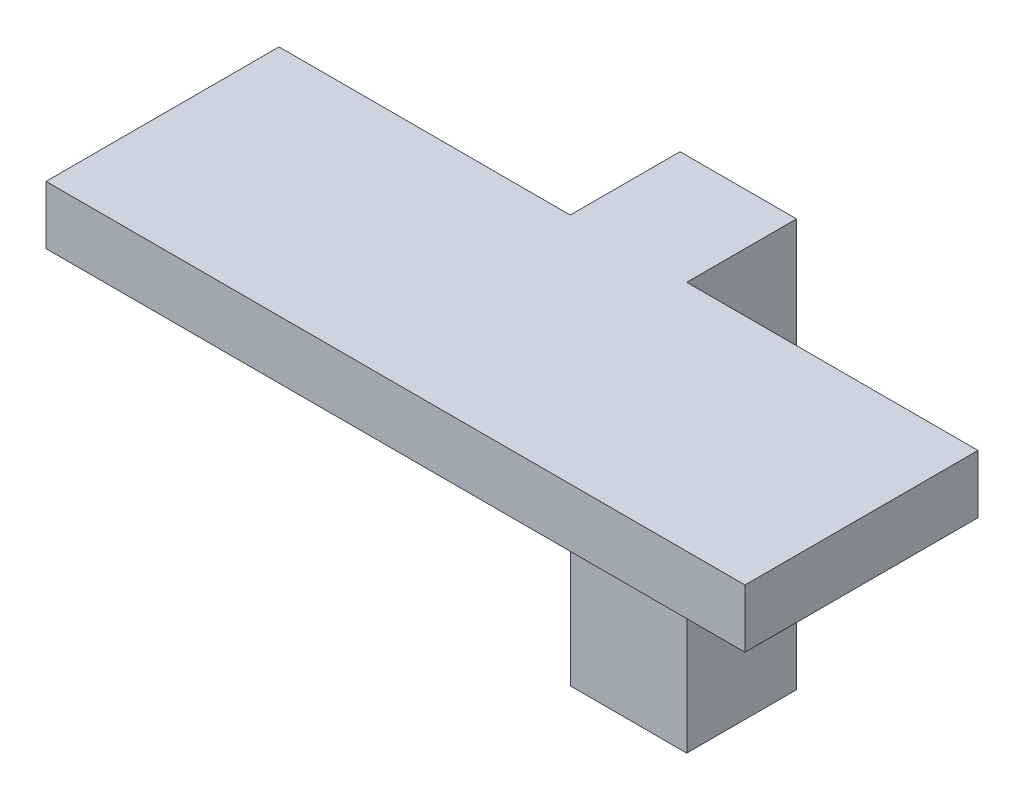
ISO-10303-21;
HEADER;
FILE_DESCRIPTION(('STEP AP214'),'2;1');
FILE_NAME('part.step','',(''),(''),'','','');
FILE_SCHEMA(('AUTOMOTIVE_DESIGN { 1 0 10303 214 1 1 1 1 }'));
ENDSEC;
DATA;
#1=APPLICATION_CONTEXT('core data for automotive mechanical design processes');
#2=APPLICATION_PROTOCOL_DEFINITION('international standard','automotive_design',2000,#1);
#3=PRODUCT_CONTEXT('',#1,'mechanical');
#4=PRODUCT('Part','Part','',(#3));
#5=PRODUCT_RELATED_PRODUCT_CATEGORY('part','',(#4));
#6=PRODUCT_DEFINITION_FORMATION('','',#4);
#7=PRODUCT_DEFINITION_CONTEXT('part definition',#1,'design');
#8=PRODUCT_DEFINITION('design','',#6,#7);
#9=PRODUCT_DEFINITION_SHAPE('','',#8);
#10=(LENGTH_UNIT() NAMED_UNIT(*) SI_UNIT(.MILLI.,.METRE.));
#11=(NAMED_UNIT(*) PLANE_ANGLE_UNIT() SI_UNIT($,.RADIAN.));
#12=(NAMED_UNIT(*) SI_UNIT($,.STERADIAN.) SOLID_ANGLE_UNIT());
#13=UNCERTAINTY_MEASURE_WITH_UNIT(LENGTH_MEASURE(1.E-05),#10,'distance_accuracy_value','');
#14=(GEOMETRIC_REPRESENTATION_CONTEXT(3) GLOBAL_UNCERTAINTY_ASSIGNED_CONTEXT((#13)) GLOBAL_UNIT_ASSIGNED_CONTEXT((#10,
#11,#12)) REPRESENTATION_CONTEXT('',''));
#15=CARTESIAN_POINT('',(0.,0.,0.));
#16=DIRECTION('',(0.,0.,1.));
#17=DIRECTION('',(1.,0.,0.));
#18=AXIS2_PLACEMENT_3D('',#15,#16,#17);
#19=CARTESIAN_POINT('',(0.,5.,-10.));
#20=DIRECTION('',(0.,0.,-1.));
#21=DIRECTION('',(-1.,0.,0.));
#22=AXIS2_PLACEMENT_3D('',#19,#20,#21);
#23=PLANE('',#22);
#24=DIRECTION('',(1.,0.,0.));
#25=VECTOR('',#24,1.);
#26=CARTESIAN_POINT('',(0.,0.,-10.));
#27=LINE('',#26,#25);
#28=CARTESIAN_POINT('',(-30.,0.,-10.));
#29=VERTEX_POINT('',#28);
#30=CARTESIAN_POINT('',(-5.00000000000001,0.,-10.));
#31=VERTEX_POINT('',#30);
#32=EDGE_CURVE('E140',#29,#31,#27,.T.);
#33=ORIENTED_EDGE('',*,*,#32,.F.);
#34=DIRECTION('',(0.,-1.,0.));
#35=VECTOR('',#34,1.);
#36=CARTESIAN_POINT('',(-30.,5.,-10.));
#37=LINE('',#36,#35);
#38=CARTESIAN_POINT('',(-30.,5.,-10.));
#39=VERTEX_POINT('',#38);
#40=EDGE_CURVE('E11',#39,#29,#37,.T.);
#41=ORIENTED_EDGE('',*,*,#40,.F.);
#42=DIRECTION('',(1.,0.,0.));
#43=VECTOR('',#42,1.);
#44=CARTESIAN_POINT('',(0.,5.,-10.));
#45=LINE('',#44,#43);
#46=CARTESIAN_POINT('',(-5.00000000000001,5.,-10.));
#47=VERTEX_POINT('',#46);
#48=EDGE_CURVE('E176',#39,#47,#45,.T.);
#49=ORIENTED_EDGE('',*,*,#48,.T.);
#50=DIRECTION('',(0.,-1.,0.));
#51=VECTOR('',#50,1.);
#52=CARTESIAN_POINT('',(-5.00000000000001,5.,-10.));
#53=LINE('',#52,#51);
#54=EDGE_CURVE('E136',#47,#31,#53,.T.);
#55=ORIENTED_EDGE('',*,*,#54,.T.);
#56=EDGE_LOOP('',(#33,#41,#49,#55));
#57=FACE_BOUND('',#56,.T.);
#58=ADVANCED_FACE('F39',(#57),#23,.T.);
#59=CARTESIAN_POINT('',(-30.,5.,0.));
#60=DIRECTION('',(1.,0.,0.));
#61=DIRECTION('',(0.,0.,-1.));
#62=AXIS2_PLACEMENT_3D('',#59,#60,#61);
#63=PLANE('',#62);
#64=DIRECTION('',(0.,0.,1.));
#65=VECTOR('',#64,1.);
#66=CARTESIAN_POINT('',(-30.,0.,0.));
#67=LINE('',#66,#65);
#68=CARTESIAN_POINT('',(-30.,0.,10.));
#69=VERTEX_POINT('',#68);
#70=EDGE_CURVE('E143',#29,#69,#67,.T.);
#71=ORIENTED_EDGE('',*,*,#70,.T.);
#72=DIRECTION('',(0.,-1.,0.));
#73=VECTOR('',#72,1.);
#74=CARTESIAN_POINT('',(-30.,5.,10.));
#75=LINE('',#74,#73);
#76=CARTESIAN_POINT('',(-30.,5.,10.));
#77=VERTEX_POINT('',#76);
#78=EDGE_CURVE('E48',#77,#69,#75,.T.);
#79=ORIENTED_EDGE('',*,*,#78,.F.);
#80=DIRECTION('',(0.,0.,1.));
#81=VECTOR('',#80,1.);
#82=CARTESIAN_POINT('',(-30.,5.,0.));
#83=LINE('',#82,#81);
#84=EDGE_CURVE('E177',#39,#77,#83,.T.);
#85=ORIENTED_EDGE('',*,*,#84,.F.);
#86=ORIENTED_EDGE('',*,*,#40,.T.);
#87=EDGE_LOOP('',(#71,#79,#85,#86));
#88=FACE_BOUND('',#87,.T.);
#89=ADVANCED_FACE('F41',(#88),#63,.F.);
#90=CARTESIAN_POINT('',(0.,5.,10.));
#91=DIRECTION('',(0.,0.,-1.));
#92=DIRECTION('',(-1.,0.,0.));
#93=AXIS2_PLACEMENT_3D('',#90,#91,#92);
#94=PLANE('',#93);
#95=DIRECTION('',(1.,0.,0.));
#96=VECTOR('',#95,1.);
#97=CARTESIAN_POINT('',(0.,0.,10.));
#98=LINE('',#97,#96);
#99=CARTESIAN_POINT('',(30.,0.,10.));
#100=VERTEX_POINT('',#99);
#101=EDGE_CURVE('E146',#69,#100,#98,.T.);
#102=ORIENTED_EDGE('',*,*,#101,.T.);
#103=DIRECTION('',(0.,-1.,0.));
#104=VECTOR('',#103,1.);
#105=CARTESIAN_POINT('',(30.,5.,10.));
#106=LINE('',#105,#104);
#107=CARTESIAN_POINT('',(30.,5.,10.));
#108=VERTEX_POINT('',#107);
#109=EDGE_CURVE('E157',#108,#100,#106,.T.);
#110=ORIENTED_EDGE('',*,*,#109,.F.);
#111=DIRECTION('',(1.,0.,0.));
#112=VECTOR('',#111,1.);
#113=CARTESIAN_POINT('',(0.,5.,10.));
#114=LINE('',#113,#112);
#115=EDGE_CURVE('E165',#77,#108,#114,.T.);
#116=ORIENTED_EDGE('',*,*,#115,.F.);
#117=ORIENTED_EDGE('',*,*,#78,.T.);
#118=EDGE_LOOP('',(#102,#110,#116,#117));
#119=FACE_BOUND('',#118,.T.);
#120=ADVANCED_FACE('F163',(#119),#94,.F.);
#121=CARTESIAN_POINT('',(30.,5.,0.));
#122=DIRECTION('',(1.,0.,0.));
#123=DIRECTION('',(0.,0.,-1.));
#124=AXIS2_PLACEMENT_3D('',#121,#122,#123);
#125=PLANE('',#124);
#126=DIRECTION('',(0.,0.,1.));
#127=VECTOR('',#126,1.);
#128=CARTESIAN_POINT('',(30.,0.,0.));
#129=LINE('',#128,#127);
#130=CARTESIAN_POINT('',(30.,0.,-10.));
#131=VERTEX_POINT('',#130);
#132=EDGE_CURVE('E149',#131,#100,#129,.T.);
#133=ORIENTED_EDGE('',*,*,#132,.F.);
#134=DIRECTION('',(0.,-1.,0.));
#135=VECTOR('',#134,1.);
#136=CARTESIAN_POINT('',(30.,5.,-10.));
#137=LINE('',#136,#135);
#138=CARTESIAN_POINT('',(30.,5.,-10.));
#139=VERTEX_POINT('',#138);
#140=EDGE_CURVE('E77',#139,#131,#137,.T.);
#141=ORIENTED_EDGE('',*,*,#140,.F.);
#142=DIRECTION('',(0.,0.,1.));
#143=VECTOR('',#142,1.);
#144=CARTESIAN_POINT('',(30.,5.,0.));
#145=LINE('',#144,#143);
#146=EDGE_CURVE('E174',#139,#108,#145,.T.);
#147=ORIENTED_EDGE('',*,*,#146,.T.);
#148=ORIENTED_EDGE('',*,*,#109,.T.);
#149=EDGE_LOOP('',(#133,#141,#147,#148));
#150=FACE_BOUND('',#149,.T.);
#151=ADVANCED_FACE('F172',(#150),#125,.T.);
#152=CARTESIAN_POINT('',(5.,0.,-10.));
#153=VERTEX_POINT('',#152);
#154=EDGE_CURVE('E144',#153,#131,#27,.T.);
#155=ORIENTED_EDGE('',*,*,#154,.F.);
#156=DIRECTION('',(0.,-1.,0.));
#157=VECTOR('',#156,1.);
#158=CARTESIAN_POINT('',(5.,5.,-10.));
#159=LINE('',#158,#157);
#160=CARTESIAN_POINT('',(5.,5.,-10.));
#161=VERTEX_POINT('',#160);
#162=EDGE_CURVE('E124',#161,#153,#159,.T.);
#163=ORIENTED_EDGE('',*,*,#162,.F.);
#164=EDGE_CURVE('E131',#161,#139,#45,.T.);
#165=ORIENTED_EDGE('',*,*,#164,.T.);
#166=ORIENTED_EDGE('',*,*,#140,.T.);
#167=EDGE_LOOP('',(#155,#163,#165,#166));
#168=FACE_BOUND('',#167,.T.);
#169=ADVANCED_FACE('F213',(#168),#23,.T.);
#170=CARTESIAN_POINT('',(5.,5.,0.));
#171=DIRECTION('',(1.,0.,0.));
#172=DIRECTION('',(0.,0.,-1.));
#173=AXIS2_PLACEMENT_3D('',#170,#171,#172);
#174=PLANE('',#173);
#175=ORIENTED_EDGE('',*,*,#162,.T.);
#176=DIRECTION('',(0.,1.,0.));
#177=VECTOR('',#176,1.);
#178=CARTESIAN_POINT('',(5.,-30.,-10.));
#179=LINE('',#178,#177);
#180=CARTESIAN_POINT('',(5.,-30.,-10.));
#181=VERTEX_POINT('',#180);
#182=EDGE_CURVE('E85',#181,#153,#179,.T.);
#183=ORIENTED_EDGE('',*,*,#182,.F.);
#184=DIRECTION('',(0.,0.,1.));
#185=VECTOR('',#184,1.);
#186=CARTESIAN_POINT('',(5.,-30.,0.));
#187=LINE('',#186,#185);
#188=CARTESIAN_POINT('',(4.99999999999999,-30.,-19.4230360085631));
#189=VERTEX_POINT('',#188);
#190=EDGE_CURVE('E119',#189,#181,#187,.T.);
#191=ORIENTED_EDGE('',*,*,#190,.F.);
#192=DIRECTION('',(0.,-1.,0.));
#193=VECTOR('',#192,1.);
#194=CARTESIAN_POINT('',(4.99999999999999,5.,-19.4230360085631));
#195=LINE('',#194,#193);
#196=CARTESIAN_POINT('',(4.99999999999999,5.,-19.4230360085631));
#197=VERTEX_POINT('',#196);
#198=EDGE_CURVE('E112',#197,#189,#195,.T.);
#199=ORIENTED_EDGE('',*,*,#198,.F.);
#200=DIRECTION('',(0.,0.,1.));
#201=VECTOR('',#200,1.);
#202=CARTESIAN_POINT('',(5.,5.,0.));
#203=LINE('',#202,#201);
#204=EDGE_CURVE('E116',#197,#161,#203,.T.);
#205=ORIENTED_EDGE('',*,*,#204,.T.);
#206=EDGE_LOOP('',(#175,#183,#191,#199,#205));
#207=FACE_BOUND('',#206,.T.);
#208=ADVANCED_FACE('F115',(#207),#174,.T.);
#209=CARTESIAN_POINT('',(0.,5.,-19.4230360085631));
#210=DIRECTION('',(0.,0.,-1.));
#211=DIRECTION('',(-1.,0.,0.));
#212=AXIS2_PLACEMENT_3D('',#209,#210,#211);
#213=PLANE('',#212);
#214=ORIENTED_EDGE('',*,*,#198,.T.);
#215=DIRECTION('',(1.,0.,0.));
#216=VECTOR('',#215,1.);
#217=CARTESIAN_POINT('',(0.,-30.,-19.4230360085631));
#218=LINE('',#217,#216);
#219=CARTESIAN_POINT('',(-5.00000000000001,-30.,-19.4230360085631));
#220=VERTEX_POINT('',#219);
#221=EDGE_CURVE('E192',#220,#189,#218,.T.);
#222=ORIENTED_EDGE('',*,*,#221,.F.);
#223=DIRECTION('',(0.,-1.,0.));
#224=VECTOR('',#223,1.);
#225=CARTESIAN_POINT('',(-5.00000000000001,5.,-19.4230360085631));
#226=LINE('',#225,#224);
#227=CARTESIAN_POINT('',(-5.00000000000001,5.,-19.4230360085631));
#228=VERTEX_POINT('',#227);
#229=EDGE_CURVE('E125',#228,#220,#226,.T.);
#230=ORIENTED_EDGE('',*,*,#229,.F.);
#231=DIRECTION('',(1.,0.,0.));
#232=VECTOR('',#231,1.);
#233=CARTESIAN_POINT('',(0.,5.,-19.4230360085631));
#234=LINE('',#233,#232);
#235=EDGE_CURVE('E129',#228,#197,#234,.T.);
#236=ORIENTED_EDGE('',*,*,#235,.T.);
#237=EDGE_LOOP('',(#214,#222,#230,#236));
#238=FACE_BOUND('',#237,.T.);
#239=ADVANCED_FACE('F133',(#238),#213,.T.);
#240=CARTESIAN_POINT('',(-5.00000000000001,5.,0.));
#241=DIRECTION('',(1.,0.,0.));
#242=DIRECTION('',(0.,0.,-1.));
#243=AXIS2_PLACEMENT_3D('',#240,#241,#242);
#244=PLANE('',#243);
#245=ORIENTED_EDGE('',*,*,#229,.T.);
#246=DIRECTION('',(0.,0.,1.));
#247=VECTOR('',#246,1.);
#248=CARTESIAN_POINT('',(-5.00000000000001,-30.,0.));
#249=LINE('',#248,#247);
#250=CARTESIAN_POINT('',(-5.00000000000001,-30.,-10.));
#251=VERTEX_POINT('',#250);
#252=EDGE_CURVE('E189',#220,#251,#249,.T.);
#253=ORIENTED_EDGE('',*,*,#252,.T.);
#254=DIRECTION('',(0.,1.,0.));
#255=VECTOR('',#254,1.);
#256=CARTESIAN_POINT('',(-5.00000000000001,-30.,-10.));
#257=LINE('',#256,#255);
#258=EDGE_CURVE('E181',#251,#31,#257,.T.);
#259=ORIENTED_EDGE('',*,*,#258,.T.);
#260=ORIENTED_EDGE('',*,*,#54,.F.);
#261=DIRECTION('',(0.,0.,1.));
#262=VECTOR('',#261,1.);
#263=CARTESIAN_POINT('',(-5.00000000000001,5.,0.));
#264=LINE('',#263,#262);
#265=EDGE_CURVE('E56',#228,#47,#264,.T.);
#266=ORIENTED_EDGE('',*,*,#265,.F.);
#267=EDGE_LOOP('',(#245,#253,#259,#260,#266));
#268=FACE_BOUND('',#267,.T.);
#269=ADVANCED_FACE('F204',(#268),#244,.F.);
#270=CARTESIAN_POINT('',(0.,5.,0.));
#271=DIRECTION('',(0.,1.,0.));
#272=DIRECTION('',(0.,0.,1.));
#273=AXIS2_PLACEMENT_3D('',#270,#271,#272);
#274=PLANE('',#273);
#275=ORIENTED_EDGE('',*,*,#48,.F.);
#276=ORIENTED_EDGE('',*,*,#84,.T.);
#277=ORIENTED_EDGE('',*,*,#115,.T.);
#278=ORIENTED_EDGE('',*,*,#146,.F.);
#279=ORIENTED_EDGE('',*,*,#164,.F.);
#280=ORIENTED_EDGE('',*,*,#204,.F.);
#281=ORIENTED_EDGE('',*,*,#235,.F.);
#282=ORIENTED_EDGE('',*,*,#265,.T.);
#283=EDGE_LOOP('',(#275,#276,#277,#278,#279,#280,#281,#282));
#284=FACE_BOUND('',#283,.T.);
#285=ADVANCED_FACE('F128',(#284),#274,.T.);
#286=CARTESIAN_POINT('',(0.,0.,0.));
#287=DIRECTION('',(0.,1.,0.));
#288=DIRECTION('',(0.,0.,1.));
#289=AXIS2_PLACEMENT_3D('',#286,#287,#288);
#290=PLANE('',#289);
#291=ORIENTED_EDGE('',*,*,#32,.T.);
#292=DIRECTION('',(1.,0.,0.));
#293=VECTOR('',#292,1.);
#294=CARTESIAN_POINT('',(0.,0.,-10.));
#295=LINE('',#294,#293);
#296=EDGE_CURVE('E186',#31,#153,#295,.T.);
#297=ORIENTED_EDGE('',*,*,#296,.T.);
#298=ORIENTED_EDGE('',*,*,#154,.T.);
#299=ORIENTED_EDGE('',*,*,#132,.T.);
#300=ORIENTED_EDGE('',*,*,#101,.F.);
#301=ORIENTED_EDGE('',*,*,#70,.F.);
#302=EDGE_LOOP('',(#291,#297,#298,#299,#300,#301));
#303=FACE_BOUND('',#302,.T.);
#304=ADVANCED_FACE('F169',(#303),#290,.F.);
#305=CARTESIAN_POINT('',(0.,-30.,-10.));
#306=DIRECTION('',(0.,0.,1.));
#307=DIRECTION('',(1.,0.,0.));
#308=AXIS2_PLACEMENT_3D('',#305,#306,#307);
#309=PLANE('',#308);
#310=ORIENTED_EDGE('',*,*,#296,.F.);
#311=ORIENTED_EDGE('',*,*,#258,.F.);
#312=DIRECTION('',(1.,0.,0.));
#313=VECTOR('',#312,1.);
#314=CARTESIAN_POINT('',(0.,-30.,-10.));
#315=LINE('',#314,#313);
#316=EDGE_CURVE('E184',#251,#181,#315,.T.);
#317=ORIENTED_EDGE('',*,*,#316,.T.);
#318=ORIENTED_EDGE('',*,*,#182,.T.);
#319=EDGE_LOOP('',(#310,#311,#317,#318));
#320=FACE_BOUND('',#319,.T.);
#321=ADVANCED_FACE('F200',(#320),#309,.T.);
#322=CARTESIAN_POINT('',(0.,-30.,0.));
#323=DIRECTION('',(0.,1.,0.));
#324=DIRECTION('',(0.,0.,1.));
#325=AXIS2_PLACEMENT_3D('',#322,#323,#324);
#326=PLANE('',#325);
#327=ORIENTED_EDGE('',*,*,#190,.T.);
#328=ORIENTED_EDGE('',*,*,#316,.F.);
#329=ORIENTED_EDGE('',*,*,#252,.F.);
#330=ORIENTED_EDGE('',*,*,#221,.T.);
#331=EDGE_LOOP('',(#327,#328,#329,#330));
#332=FACE_BOUND('',#331,.T.);
#333=ADVANCED_FACE('F196',(#332),#326,.F.);
#334=CLOSED_SHELL('',(#58,#89,#120,#151,#169,#208,#239,#269,#285,#304,#321,#333));
#335=MANIFOLD_SOLID_BREP('B2',#334);
#336=ADVANCED_BREP_SHAPE_REPRESENTATION('',(#18,#335),#14);
#337=SHAPE_DEFINITION_REPRESENTATION(#9,#336);
ENDSEC;
END-ISO-10303-21;
